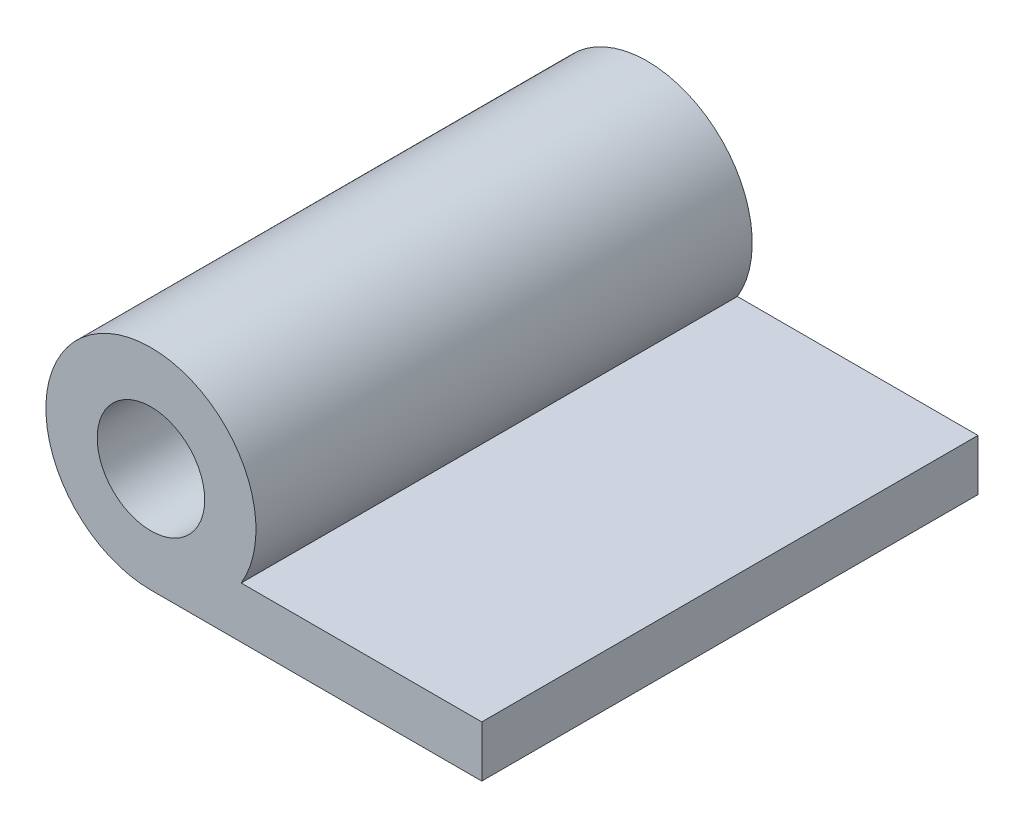
ISO-10303-21;
HEADER;
FILE_DESCRIPTION(('STEP AP214'),'2;1');
FILE_NAME('part.step','',(''),(''),'','','');
FILE_SCHEMA(('AUTOMOTIVE_DESIGN { 1 0 10303 214 1 1 1 1 }'));
ENDSEC;
DATA;
#1=APPLICATION_CONTEXT('core data for automotive mechanical design processes');
#2=APPLICATION_PROTOCOL_DEFINITION('international standard','automotive_design',2000,#1);
#3=PRODUCT_CONTEXT('',#1,'mechanical');
#4=PRODUCT('Part','Part','',(#3));
#5=PRODUCT_RELATED_PRODUCT_CATEGORY('part','',(#4));
#6=PRODUCT_DEFINITION_FORMATION('','',#4);
#7=PRODUCT_DEFINITION_CONTEXT('part definition',#1,'design');
#8=PRODUCT_DEFINITION('design','',#6,#7);
#9=PRODUCT_DEFINITION_SHAPE('','',#8);
#10=(LENGTH_UNIT() NAMED_UNIT(*) SI_UNIT(.MILLI.,.METRE.));
#11=(NAMED_UNIT(*) PLANE_ANGLE_UNIT() SI_UNIT($,.RADIAN.));
#12=(NAMED_UNIT(*) SI_UNIT($,.STERADIAN.) SOLID_ANGLE_UNIT());
#13=UNCERTAINTY_MEASURE_WITH_UNIT(LENGTH_MEASURE(1.E-05),#10,'distance_accuracy_value','');
#14=(GEOMETRIC_REPRESENTATION_CONTEXT(3) GLOBAL_UNCERTAINTY_ASSIGNED_CONTEXT((#13)) GLOBAL_UNIT_ASSIGNED_CONTEXT((#10,
#11,#12)) REPRESENTATION_CONTEXT('',''));
#15=CARTESIAN_POINT('',(0.,0.,0.));
#16=DIRECTION('',(0.,0.,1.));
#17=DIRECTION('',(1.,0.,0.));
#18=AXIS2_PLACEMENT_3D('',#15,#16,#17);
#19=CARTESIAN_POINT('',(0.,0.,15.));
#20=DIRECTION('',(0.,0.,1.));
#21=DIRECTION('',(1.,0.,0.));
#22=AXIS2_PLACEMENT_3D('',#19,#20,#21);
#23=PLANE('',#22);
#24=CARTESIAN_POINT('',(0.,0.,15.));
#25=DIRECTION('',(0.,0.,1.));
#26=DIRECTION('',(1.,0.,0.));
#27=AXIS2_PLACEMENT_3D('',#24,#25,#26);
#28=CIRCLE('',#27,6.35);
#29=CARTESIAN_POINT('',(5.45527267879434,-3.25,15.));
#30=VERTEX_POINT('',#29);
#31=CARTESIAN_POINT('',(0.,-6.35,15.));
#32=VERTEX_POINT('',#31);
#33=EDGE_CURVE('E11',#30,#32,#28,.T.);
#34=ORIENTED_EDGE('',*,*,#33,.T.);
#35=DIRECTION('',(1.,0.,0.));
#36=VECTOR('',#35,1.);
#37=CARTESIAN_POINT('',(0.,-6.35,15.));
#38=LINE('',#37,#36);
#39=CARTESIAN_POINT('',(20.,-6.35,15.));
#40=VERTEX_POINT('',#39);
#41=EDGE_CURVE('E76',#32,#40,#38,.T.);
#42=ORIENTED_EDGE('',*,*,#41,.T.);
#43=DIRECTION('',(0.,1.,0.));
#44=VECTOR('',#43,1.);
#45=CARTESIAN_POINT('',(20.,-6.35,15.));
#46=LINE('',#45,#44);
#47=CARTESIAN_POINT('',(20.,-3.25,15.));
#48=VERTEX_POINT('',#47);
#49=EDGE_CURVE('E84',#40,#48,#46,.T.);
#50=ORIENTED_EDGE('',*,*,#49,.T.);
#51=DIRECTION('',(-1.,0.,0.));
#52=VECTOR('',#51,1.);
#53=CARTESIAN_POINT('',(0.,-3.25,15.));
#54=LINE('',#53,#52);
#55=EDGE_CURVE('E90',#48,#30,#54,.T.);
#56=ORIENTED_EDGE('',*,*,#55,.T.);
#57=EDGE_LOOP('',(#34,#42,#50,#56));
#58=FACE_BOUND('',#57,.T.);
#59=CARTESIAN_POINT('',(0.,0.,15.));
#60=DIRECTION('',(0.,0.,1.));
#61=DIRECTION('',(1.,0.,0.));
#62=AXIS2_PLACEMENT_3D('',#59,#60,#61);
#63=CIRCLE('',#62,3.25);
#64=CARTESIAN_POINT('',(3.25,0.,15.));
#65=VERTEX_POINT('',#64);
#66=EDGE_CURVE('E106',#65,#65,#63,.T.);
#67=ORIENTED_EDGE('',*,*,#66,.F.);
#68=EDGE_LOOP('',(#67));
#69=FACE_BOUND('',#68,.T.);
#70=ADVANCED_FACE('F33',(#58,#69),#23,.T.);
#71=CARTESIAN_POINT('',(0.,0.,-15.));
#72=DIRECTION('',(0.,0.,1.));
#73=DIRECTION('',(1.,0.,0.));
#74=AXIS2_PLACEMENT_3D('',#71,#72,#73);
#75=PLANE('',#74);
#76=DIRECTION('',(-1.,0.,0.));
#77=VECTOR('',#76,1.);
#78=CARTESIAN_POINT('',(0.,-6.35,-15.));
#79=LINE('',#78,#77);
#80=CARTESIAN_POINT('',(20.,-6.35,-15.));
#81=VERTEX_POINT('',#80);
#82=CARTESIAN_POINT('',(0.,-6.35,-15.));
#83=VERTEX_POINT('',#82);
#84=EDGE_CURVE('E77',#81,#83,#79,.T.);
#85=ORIENTED_EDGE('',*,*,#84,.T.);
#86=CARTESIAN_POINT('',(0.,0.,-15.));
#87=DIRECTION('',(0.,0.,1.));
#88=DIRECTION('',(1.,0.,0.));
#89=AXIS2_PLACEMENT_3D('',#86,#87,#88);
#90=CIRCLE('',#89,6.35);
#91=CARTESIAN_POINT('',(5.45527267879434,-3.25,-15.));
#92=VERTEX_POINT('',#91);
#93=EDGE_CURVE('E37',#92,#83,#90,.T.);
#94=ORIENTED_EDGE('',*,*,#93,.F.);
#95=DIRECTION('',(1.,0.,0.));
#96=VECTOR('',#95,1.);
#97=CARTESIAN_POINT('',(0.,-3.25,-15.));
#98=LINE('',#97,#96);
#99=CARTESIAN_POINT('',(20.,-3.25,-15.));
#100=VERTEX_POINT('',#99);
#101=EDGE_CURVE('E95',#92,#100,#98,.T.);
#102=ORIENTED_EDGE('',*,*,#101,.T.);
#103=DIRECTION('',(0.,-1.,0.));
#104=VECTOR('',#103,1.);
#105=CARTESIAN_POINT('',(20.,-6.35,-15.));
#106=LINE('',#105,#104);
#107=EDGE_CURVE('E99',#100,#81,#106,.T.);
#108=ORIENTED_EDGE('',*,*,#107,.T.);
#109=EDGE_LOOP('',(#85,#94,#102,#108));
#110=FACE_BOUND('',#109,.T.);
#111=CARTESIAN_POINT('',(0.,0.,-15.));
#112=DIRECTION('',(0.,0.,1.));
#113=DIRECTION('',(1.,0.,0.));
#114=AXIS2_PLACEMENT_3D('',#111,#112,#113);
#115=CIRCLE('',#114,3.25);
#116=CARTESIAN_POINT('',(3.25,0.,-15.));
#117=VERTEX_POINT('',#116);
#118=EDGE_CURVE('E105',#117,#117,#115,.T.);
#119=ORIENTED_EDGE('',*,*,#118,.T.);
#120=EDGE_LOOP('',(#119));
#121=FACE_BOUND('',#120,.T.);
#122=ADVANCED_FACE('F112',(#110,#121),#75,.F.);
#123=CARTESIAN_POINT('',(0.,0.,15.));
#124=DIRECTION('',(0.,0.,-1.));
#125=DIRECTION('',(-1.,0.,0.));
#126=AXIS2_PLACEMENT_3D('',#123,#124,#125);
#127=CYLINDRICAL_SURFACE('',#126,6.35);
#128=ORIENTED_EDGE('',*,*,#33,.F.);
#129=DIRECTION('',(0.,0.,-1.));
#130=VECTOR('',#129,1.);
#131=CARTESIAN_POINT('',(5.45527267879434,-3.25,15.));
#132=LINE('',#131,#130);
#133=EDGE_CURVE('E103',#30,#92,#132,.T.);
#134=ORIENTED_EDGE('',*,*,#133,.T.);
#135=ORIENTED_EDGE('',*,*,#93,.T.);
#136=DIRECTION('',(0.,0.,1.));
#137=VECTOR('',#136,1.);
#138=CARTESIAN_POINT('',(0.,-6.35,-35.238824076512));
#139=LINE('',#138,#137);
#140=EDGE_CURVE('E81',#83,#32,#139,.T.);
#141=ORIENTED_EDGE('',*,*,#140,.T.);
#142=EDGE_LOOP('',(#128,#134,#135,#141));
#143=FACE_BOUND('',#142,.T.);
#144=ADVANCED_FACE('F35',(#143),#127,.T.);
#145=CARTESIAN_POINT('',(0.,0.,15.));
#146=DIRECTION('',(0.,0.,-1.));
#147=DIRECTION('',(-1.,0.,0.));
#148=AXIS2_PLACEMENT_3D('',#145,#146,#147);
#149=CYLINDRICAL_SURFACE('',#148,3.25);
#150=ORIENTED_EDGE('',*,*,#118,.F.);
#151=EDGE_LOOP('',(#150));
#152=FACE_BOUND('',#151,.T.);
#153=ORIENTED_EDGE('',*,*,#66,.T.);
#154=EDGE_LOOP('',(#153));
#155=FACE_BOUND('',#154,.T.);
#156=ADVANCED_FACE('F114',(#152,#155),#149,.F.);
#157=CARTESIAN_POINT('',(0.,-3.25,-35.238824076512));
#158=DIRECTION('',(0.,1.,0.));
#159=DIRECTION('',(0.,0.,1.));
#160=AXIS2_PLACEMENT_3D('',#157,#158,#159);
#161=PLANE('',#160);
#162=ORIENTED_EDGE('',*,*,#133,.F.);
#163=ORIENTED_EDGE('',*,*,#55,.F.);
#164=DIRECTION('',(0.,0.,1.));
#165=VECTOR('',#164,1.);
#166=CARTESIAN_POINT('',(20.,-3.25,-35.238824076512));
#167=LINE('',#166,#165);
#168=EDGE_CURVE('E80',#100,#48,#167,.T.);
#169=ORIENTED_EDGE('',*,*,#168,.F.);
#170=ORIENTED_EDGE('',*,*,#101,.F.);
#171=EDGE_LOOP('',(#162,#163,#169,#170));
#172=FACE_BOUND('',#171,.T.);
#173=ADVANCED_FACE('F117',(#172),#161,.T.);
#174=CARTESIAN_POINT('',(20.,-6.35,-35.238824076512));
#175=DIRECTION('',(1.,0.,0.));
#176=DIRECTION('',(0.,0.,-1.));
#177=AXIS2_PLACEMENT_3D('',#174,#175,#176);
#178=PLANE('',#177);
#179=ORIENTED_EDGE('',*,*,#107,.F.);
#180=ORIENTED_EDGE('',*,*,#168,.T.);
#181=ORIENTED_EDGE('',*,*,#49,.F.);
#182=DIRECTION('',(0.,0.,1.));
#183=VECTOR('',#182,1.);
#184=CARTESIAN_POINT('',(20.,-6.35,-35.238824076512));
#185=LINE('',#184,#183);
#186=EDGE_CURVE('E71',#81,#40,#185,.T.);
#187=ORIENTED_EDGE('',*,*,#186,.F.);
#188=EDGE_LOOP('',(#179,#180,#181,#187));
#189=FACE_BOUND('',#188,.T.);
#190=ADVANCED_FACE('F85',(#189),#178,.T.);
#191=CARTESIAN_POINT('',(0.,-6.35,-35.238824076512));
#192=DIRECTION('',(0.,-1.,0.));
#193=DIRECTION('',(0.,0.,-1.));
#194=AXIS2_PLACEMENT_3D('',#191,#192,#193);
#195=PLANE('',#194);
#196=ORIENTED_EDGE('',*,*,#84,.F.);
#197=ORIENTED_EDGE('',*,*,#186,.T.);
#198=ORIENTED_EDGE('',*,*,#41,.F.);
#199=ORIENTED_EDGE('',*,*,#140,.F.);
#200=EDGE_LOOP('',(#196,#197,#198,#199));
#201=FACE_BOUND('',#200,.T.);
#202=ADVANCED_FACE('F73',(#201),#195,.T.);
#203=CLOSED_SHELL('',(#70,#122,#144,#156,#173,#190,#202));
#204=MANIFOLD_SOLID_BREP('B2',#203);
#205=ADVANCED_BREP_SHAPE_REPRESENTATION('',(#18,#204),#14);
#206=SHAPE_DEFINITION_REPRESENTATION(#9,#205);
ENDSEC;
END-ISO-10303-21;
